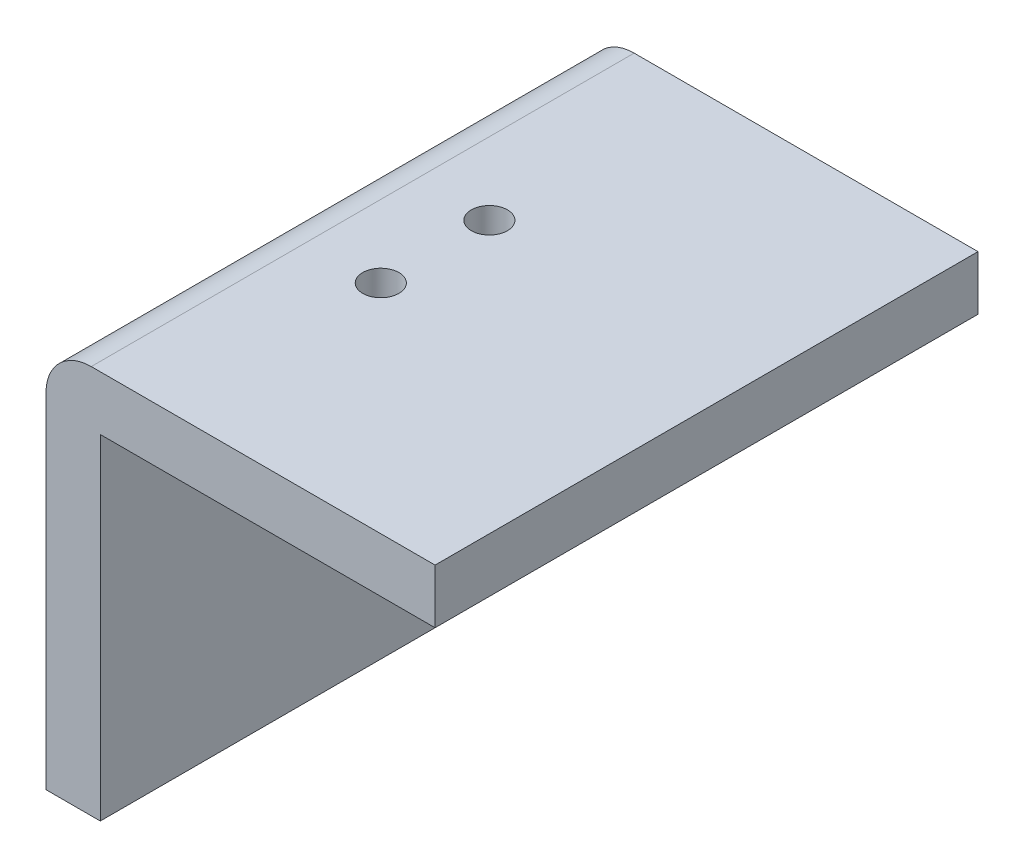
ISO-10303-21;
HEADER;
FILE_DESCRIPTION(('STEP AP214'),'2;1');
FILE_NAME('part.step','',(''),(''),'','','');
FILE_SCHEMA(('AUTOMOTIVE_DESIGN { 1 0 10303 214 1 1 1 1 }'));
ENDSEC;
DATA;
#1=APPLICATION_CONTEXT('core data for automotive mechanical design processes');
#2=APPLICATION_PROTOCOL_DEFINITION('international standard','automotive_design',2000,#1);
#3=PRODUCT_CONTEXT('',#1,'mechanical');
#4=PRODUCT('Part','Part','',(#3));
#5=PRODUCT_RELATED_PRODUCT_CATEGORY('part','',(#4));
#6=PRODUCT_DEFINITION_FORMATION('','',#4);
#7=PRODUCT_DEFINITION_CONTEXT('part definition',#1,'design');
#8=PRODUCT_DEFINITION('design','',#6,#7);
#9=PRODUCT_DEFINITION_SHAPE('','',#8);
#10=(LENGTH_UNIT() NAMED_UNIT(*) SI_UNIT(.MILLI.,.METRE.));
#11=(NAMED_UNIT(*) PLANE_ANGLE_UNIT() SI_UNIT($,.RADIAN.));
#12=(NAMED_UNIT(*) SI_UNIT($,.STERADIAN.) SOLID_ANGLE_UNIT());
#13=UNCERTAINTY_MEASURE_WITH_UNIT(LENGTH_MEASURE(1.E-05),#10,'distance_accuracy_value','');
#14=(GEOMETRIC_REPRESENTATION_CONTEXT(3) GLOBAL_UNCERTAINTY_ASSIGNED_CONTEXT((#13)) GLOBAL_UNIT_ASSIGNED_CONTEXT((#10,
#11,#12)) REPRESENTATION_CONTEXT('',''));
#15=CARTESIAN_POINT('',(0.,0.,0.));
#16=DIRECTION('',(0.,0.,1.));
#17=DIRECTION('',(1.,0.,0.));
#18=AXIS2_PLACEMENT_3D('',#15,#16,#17);
#19=CARTESIAN_POINT('',(-1.5,0.,30.));
#20=DIRECTION('',(-1.,0.,0.));
#21=DIRECTION('',(0.,0.,1.));
#22=AXIS2_PLACEMENT_3D('',#19,#20,#21);
#23=PLANE('',#22);
#24=DIRECTION('',(0.,1.,0.));
#25=VECTOR('',#24,1.);
#26=CARTESIAN_POINT('',(-1.5,0.,0.));
#27=LINE('',#26,#25);
#28=CARTESIAN_POINT('',(-1.5,0.,0.));
#29=VERTEX_POINT('',#28);
#30=CARTESIAN_POINT('',(-1.5,19.,0.));
#31=VERTEX_POINT('',#30);
#32=EDGE_CURVE('E126',#29,#31,#27,.T.);
#33=ORIENTED_EDGE('',*,*,#32,.F.);
#34=DIRECTION('',(0.,0.,-1.));
#35=VECTOR('',#34,1.);
#36=CARTESIAN_POINT('',(-1.5,0.,30.));
#37=LINE('',#36,#35);
#38=CARTESIAN_POINT('',(-1.5,0.,30.));
#39=VERTEX_POINT('',#38);
#40=EDGE_CURVE('E11',#39,#29,#37,.T.);
#41=ORIENTED_EDGE('',*,*,#40,.F.);
#42=DIRECTION('',(0.,1.,0.));
#43=VECTOR('',#42,1.);
#44=CARTESIAN_POINT('',(-1.5,0.,30.));
#45=LINE('',#44,#43);
#46=CARTESIAN_POINT('',(-1.5,19.,30.));
#47=VERTEX_POINT('',#46);
#48=EDGE_CURVE('E142',#39,#47,#45,.T.);
#49=ORIENTED_EDGE('',*,*,#48,.T.);
#50=DIRECTION('',(0.,0.,-1.));
#51=VECTOR('',#50,1.);
#52=CARTESIAN_POINT('',(-1.5,19.,30.));
#53=LINE('',#52,#51);
#54=EDGE_CURVE('E55',#47,#31,#53,.T.);
#55=ORIENTED_EDGE('',*,*,#54,.T.);
#56=EDGE_LOOP('',(#33,#41,#49,#55));
#57=FACE_BOUND('',#56,.T.);
#58=ADVANCED_FACE('F39',(#57),#23,.T.);
#59=CARTESIAN_POINT('',(0.,0.,30.));
#60=DIRECTION('',(0.,1.,0.));
#61=DIRECTION('',(0.,0.,1.));
#62=AXIS2_PLACEMENT_3D('',#59,#60,#61);
#63=PLANE('',#62);
#64=DIRECTION('',(1.,0.,0.));
#65=VECTOR('',#64,1.);
#66=CARTESIAN_POINT('',(0.,0.,0.));
#67=LINE('',#66,#65);
#68=CARTESIAN_POINT('',(1.5,0.,0.));
#69=VERTEX_POINT('',#68);
#70=EDGE_CURVE('E128',#29,#69,#67,.T.);
#71=ORIENTED_EDGE('',*,*,#70,.T.);
#72=DIRECTION('',(0.,0.,-1.));
#73=VECTOR('',#72,1.);
#74=CARTESIAN_POINT('',(1.5,0.,30.));
#75=LINE('',#74,#73);
#76=CARTESIAN_POINT('',(1.5,0.,30.));
#77=VERTEX_POINT('',#76);
#78=EDGE_CURVE('E47',#77,#69,#75,.T.);
#79=ORIENTED_EDGE('',*,*,#78,.F.);
#80=DIRECTION('',(1.,0.,0.));
#81=VECTOR('',#80,1.);
#82=CARTESIAN_POINT('',(0.,0.,30.));
#83=LINE('',#82,#81);
#84=EDGE_CURVE('E163',#39,#77,#83,.T.);
#85=ORIENTED_EDGE('',*,*,#84,.F.);
#86=ORIENTED_EDGE('',*,*,#40,.T.);
#87=EDGE_LOOP('',(#71,#79,#85,#86));
#88=FACE_BOUND('',#87,.T.);
#89=ADVANCED_FACE('F201',(#88),#63,.F.);
#90=CARTESIAN_POINT('',(1.5,0.,30.));
#91=DIRECTION('',(-1.,0.,0.));
#92=DIRECTION('',(0.,0.,1.));
#93=AXIS2_PLACEMENT_3D('',#90,#91,#92);
#94=PLANE('',#93);
#95=DIRECTION('',(0.,1.,0.));
#96=VECTOR('',#95,1.);
#97=CARTESIAN_POINT('',(1.5,0.,0.));
#98=LINE('',#97,#96);
#99=CARTESIAN_POINT('',(1.5,18.5,0.));
#100=VERTEX_POINT('',#99);
#101=EDGE_CURVE('E131',#69,#100,#98,.T.);
#102=ORIENTED_EDGE('',*,*,#101,.T.);
#103=DIRECTION('',(0.,0.,-1.));
#104=VECTOR('',#103,1.);
#105=CARTESIAN_POINT('',(1.5,18.5,30.));
#106=LINE('',#105,#104);
#107=CARTESIAN_POINT('',(1.5,18.5,30.));
#108=VERTEX_POINT('',#107);
#109=EDGE_CURVE('E146',#108,#100,#106,.T.);
#110=ORIENTED_EDGE('',*,*,#109,.F.);
#111=DIRECTION('',(0.,1.,0.));
#112=VECTOR('',#111,1.);
#113=CARTESIAN_POINT('',(1.5,0.,30.));
#114=LINE('',#113,#112);
#115=EDGE_CURVE('E155',#77,#108,#114,.T.);
#116=ORIENTED_EDGE('',*,*,#115,.F.);
#117=ORIENTED_EDGE('',*,*,#78,.T.);
#118=EDGE_LOOP('',(#102,#110,#116,#117));
#119=FACE_BOUND('',#118,.T.);
#120=ADVANCED_FACE('F153',(#119),#94,.F.);
#121=CARTESIAN_POINT('',(0.,18.5,30.));
#122=DIRECTION('',(0.,1.,0.));
#123=DIRECTION('',(0.,0.,1.));
#124=AXIS2_PLACEMENT_3D('',#121,#122,#123);
#125=PLANE('',#124);
#126=CARTESIAN_POINT('',(5.00000000000001,18.5,18.0000000000001));
#127=DIRECTION('',(0.,-1.,0.));
#128=DIRECTION('',(0.,0.,-1.));
#129=AXIS2_PLACEMENT_3D('',#126,#127,#128);
#130=CIRCLE('',#129,0.999999999999987);
#131=CARTESIAN_POINT('',(5.00000000000001,18.5,17.0000000000001));
#132=VERTEX_POINT('',#131);
#133=EDGE_CURVE('E176',#132,#132,#130,.T.);
#134=ORIENTED_EDGE('',*,*,#133,.F.);
#135=EDGE_LOOP('',(#134));
#136=FACE_BOUND('',#135,.T.);
#137=CARTESIAN_POINT('',(4.99999999999999,18.5,12.0000000000001));
#138=DIRECTION('',(0.,-1.,0.));
#139=DIRECTION('',(0.,0.,-1.));
#140=AXIS2_PLACEMENT_3D('',#137,#138,#139);
#141=CIRCLE('',#140,0.999999999999987);
#142=CARTESIAN_POINT('',(4.99999999999999,18.5,11.0000000000001));
#143=VERTEX_POINT('',#142);
#144=EDGE_CURVE('E170',#143,#143,#141,.T.);
#145=ORIENTED_EDGE('',*,*,#144,.F.);
#146=EDGE_LOOP('',(#145));
#147=FACE_BOUND('',#146,.T.);
#148=DIRECTION('',(1.,0.,0.));
#149=VECTOR('',#148,1.);
#150=CARTESIAN_POINT('',(0.,18.5,0.));
#151=LINE('',#150,#149);
#152=CARTESIAN_POINT('',(20.,18.5,0.));
#153=VERTEX_POINT('',#152);
#154=EDGE_CURVE('E133',#100,#153,#151,.T.);
#155=ORIENTED_EDGE('',*,*,#154,.T.);
#156=DIRECTION('',(0.,0.,-1.));
#157=VECTOR('',#156,1.);
#158=CARTESIAN_POINT('',(20.,18.5,30.));
#159=LINE('',#158,#157);
#160=CARTESIAN_POINT('',(20.,18.5,30.));
#161=VERTEX_POINT('',#160);
#162=EDGE_CURVE('E108',#161,#153,#159,.T.);
#163=ORIENTED_EDGE('',*,*,#162,.F.);
#164=DIRECTION('',(1.,0.,0.));
#165=VECTOR('',#164,1.);
#166=CARTESIAN_POINT('',(0.,18.5,30.));
#167=LINE('',#166,#165);
#168=EDGE_CURVE('E117',#108,#161,#167,.T.);
#169=ORIENTED_EDGE('',*,*,#168,.F.);
#170=ORIENTED_EDGE('',*,*,#109,.T.);
#171=EDGE_LOOP('',(#155,#163,#169,#170));
#172=FACE_BOUND('',#171,.T.);
#173=ADVANCED_FACE('F162',(#136,#147,#172),#125,.F.);
#174=CARTESIAN_POINT('',(20.,0.,30.));
#175=DIRECTION('',(1.,0.,0.));
#176=DIRECTION('',(0.,0.,-1.));
#177=AXIS2_PLACEMENT_3D('',#174,#175,#176);
#178=PLANE('',#177);
#179=DIRECTION('',(0.,-1.,0.));
#180=VECTOR('',#179,1.);
#181=CARTESIAN_POINT('',(20.,0.,0.));
#182=LINE('',#181,#180);
#183=CARTESIAN_POINT('',(20.,21.5,0.));
#184=VERTEX_POINT('',#183);
#185=EDGE_CURVE('E104',#184,#153,#182,.T.);
#186=ORIENTED_EDGE('',*,*,#185,.F.);
#187=DIRECTION('',(0.,0.,-1.));
#188=VECTOR('',#187,1.);
#189=CARTESIAN_POINT('',(20.,21.5,30.));
#190=LINE('',#189,#188);
#191=CARTESIAN_POINT('',(20.,21.5,30.));
#192=VERTEX_POINT('',#191);
#193=EDGE_CURVE('E99',#192,#184,#190,.T.);
#194=ORIENTED_EDGE('',*,*,#193,.F.);
#195=DIRECTION('',(0.,-1.,0.));
#196=VECTOR('',#195,1.);
#197=CARTESIAN_POINT('',(20.,0.,30.));
#198=LINE('',#197,#196);
#199=EDGE_CURVE('E102',#192,#161,#198,.T.);
#200=ORIENTED_EDGE('',*,*,#199,.T.);
#201=ORIENTED_EDGE('',*,*,#162,.T.);
#202=EDGE_LOOP('',(#186,#194,#200,#201));
#203=FACE_BOUND('',#202,.T.);
#204=ADVANCED_FACE('F101',(#203),#178,.T.);
#205=CARTESIAN_POINT('',(0.,21.5,30.));
#206=DIRECTION('',(0.,1.,0.));
#207=DIRECTION('',(-1.,0.,0.));
#208=AXIS2_PLACEMENT_3D('',#205,#206,#207);
#209=PLANE('',#208);
#210=CARTESIAN_POINT('',(5.00000000000001,21.5,18.0000000000001));
#211=DIRECTION('',(0.,-1.,0.));
#212=DIRECTION('',(0.,0.,-1.));
#213=AXIS2_PLACEMENT_3D('',#210,#211,#212);
#214=CIRCLE('',#213,0.999999999999987);
#215=CARTESIAN_POINT('',(5.00000000000001,21.5,17.0000000000001));
#216=VERTEX_POINT('',#215);
#217=EDGE_CURVE('E173',#216,#216,#214,.T.);
#218=ORIENTED_EDGE('',*,*,#217,.T.);
#219=EDGE_LOOP('',(#218));
#220=FACE_BOUND('',#219,.T.);
#221=CARTESIAN_POINT('',(4.99999999999999,21.5,12.0000000000001));
#222=DIRECTION('',(0.,-1.,0.));
#223=DIRECTION('',(0.,0.,-1.));
#224=AXIS2_PLACEMENT_3D('',#221,#222,#223);
#225=CIRCLE('',#224,0.999999999999987);
#226=CARTESIAN_POINT('',(4.99999999999999,21.5,11.0000000000001));
#227=VERTEX_POINT('',#226);
#228=EDGE_CURVE('E129',#227,#227,#225,.T.);
#229=ORIENTED_EDGE('',*,*,#228,.T.);
#230=EDGE_LOOP('',(#229));
#231=FACE_BOUND('',#230,.T.);
#232=DIRECTION('',(1.,0.,0.));
#233=VECTOR('',#232,1.);
#234=CARTESIAN_POINT('',(0.,21.5,0.));
#235=LINE('',#234,#233);
#236=CARTESIAN_POINT('',(1.,21.5,0.));
#237=VERTEX_POINT('',#236);
#238=EDGE_CURVE('E137',#237,#184,#235,.T.);
#239=ORIENTED_EDGE('',*,*,#238,.F.);
#240=DIRECTION('',(0.,0.,-1.));
#241=VECTOR('',#240,1.);
#242=CARTESIAN_POINT('',(1.,21.5,30.));
#243=LINE('',#242,#241);
#244=CARTESIAN_POINT('',(1.,21.5,30.));
#245=VERTEX_POINT('',#244);
#246=EDGE_CURVE('E77',#245,#237,#243,.T.);
#247=ORIENTED_EDGE('',*,*,#246,.F.);
#248=DIRECTION('',(1.,0.,0.));
#249=VECTOR('',#248,1.);
#250=CARTESIAN_POINT('',(0.,21.5,30.));
#251=LINE('',#250,#249);
#252=EDGE_CURVE('E115',#245,#192,#251,.T.);
#253=ORIENTED_EDGE('',*,*,#252,.T.);
#254=ORIENTED_EDGE('',*,*,#193,.T.);
#255=EDGE_LOOP('',(#239,#247,#253,#254));
#256=FACE_BOUND('',#255,.T.);
#257=ADVANCED_FACE('F120',(#220,#231,#256),#209,.T.);
#258=CARTESIAN_POINT('',(1.,19.,30.));
#259=DIRECTION('',(0.,0.,-1.));
#260=DIRECTION('',(-1.,0.,0.));
#261=AXIS2_PLACEMENT_3D('',#258,#259,#260);
#262=CYLINDRICAL_SURFACE('',#261,2.5);
#263=CARTESIAN_POINT('',(1.,19.,0.));
#264=DIRECTION('',(0.,0.,1.));
#265=DIRECTION('',(1.,0.,0.));
#266=AXIS2_PLACEMENT_3D('',#263,#264,#265);
#267=CIRCLE('',#266,2.5);
#268=EDGE_CURVE('E139',#31,#237,#267,.F.);
#269=ORIENTED_EDGE('',*,*,#268,.F.);
#270=ORIENTED_EDGE('',*,*,#54,.F.);
#271=CARTESIAN_POINT('',(1.,19.,30.));
#272=DIRECTION('',(0.,0.,1.));
#273=DIRECTION('',(1.,0.,0.));
#274=AXIS2_PLACEMENT_3D('',#271,#272,#273);
#275=CIRCLE('',#274,2.5);
#276=EDGE_CURVE('E121',#47,#245,#275,.F.);
#277=ORIENTED_EDGE('',*,*,#276,.T.);
#278=ORIENTED_EDGE('',*,*,#246,.T.);
#279=EDGE_LOOP('',(#269,#270,#277,#278));
#280=FACE_BOUND('',#279,.T.);
#281=ADVANCED_FACE('F205',(#280),#262,.T.);
#282=CARTESIAN_POINT('',(0.,0.,30.));
#283=DIRECTION('',(0.,0.,1.));
#284=DIRECTION('',(1.,0.,0.));
#285=AXIS2_PLACEMENT_3D('',#282,#283,#284);
#286=PLANE('',#285);
#287=ORIENTED_EDGE('',*,*,#48,.F.);
#288=ORIENTED_EDGE('',*,*,#84,.T.);
#289=ORIENTED_EDGE('',*,*,#115,.T.);
#290=ORIENTED_EDGE('',*,*,#168,.T.);
#291=ORIENTED_EDGE('',*,*,#199,.F.);
#292=ORIENTED_EDGE('',*,*,#252,.F.);
#293=ORIENTED_EDGE('',*,*,#276,.F.);
#294=EDGE_LOOP('',(#287,#288,#289,#290,#291,#292,#293));
#295=FACE_BOUND('',#294,.T.);
#296=ADVANCED_FACE('F113',(#295),#286,.T.);
#297=CARTESIAN_POINT('',(0.,0.,0.));
#298=DIRECTION('',(0.,0.,1.));
#299=DIRECTION('',(1.,0.,0.));
#300=AXIS2_PLACEMENT_3D('',#297,#298,#299);
#301=PLANE('',#300);
#302=ORIENTED_EDGE('',*,*,#32,.T.);
#303=ORIENTED_EDGE('',*,*,#268,.T.);
#304=ORIENTED_EDGE('',*,*,#238,.T.);
#305=ORIENTED_EDGE('',*,*,#185,.T.);
#306=ORIENTED_EDGE('',*,*,#154,.F.);
#307=ORIENTED_EDGE('',*,*,#101,.F.);
#308=ORIENTED_EDGE('',*,*,#70,.F.);
#309=EDGE_LOOP('',(#302,#303,#304,#305,#306,#307,#308));
#310=FACE_BOUND('',#309,.T.);
#311=ADVANCED_FACE('F160',(#310),#301,.F.);
#312=CARTESIAN_POINT('',(4.99999999999999,18.5,12.0000000000001));
#313=DIRECTION('',(0.,-1.,0.));
#314=DIRECTION('',(0.,0.,-1.));
#315=AXIS2_PLACEMENT_3D('',#312,#313,#314);
#316=CYLINDRICAL_SURFACE('',#315,0.999999999999987);
#317=ORIENTED_EDGE('',*,*,#228,.F.);
#318=EDGE_LOOP('',(#317));
#319=FACE_BOUND('',#318,.T.);
#320=ORIENTED_EDGE('',*,*,#144,.T.);
#321=EDGE_LOOP('',(#320));
#322=FACE_BOUND('',#321,.T.);
#323=ADVANCED_FACE('F187',(#319,#322),#316,.F.);
#324=CARTESIAN_POINT('',(5.00000000000001,18.5,18.0000000000001));
#325=DIRECTION('',(0.,-1.,0.));
#326=DIRECTION('',(0.,0.,-1.));
#327=AXIS2_PLACEMENT_3D('',#324,#325,#326);
#328=CYLINDRICAL_SURFACE('',#327,0.999999999999987);
#329=ORIENTED_EDGE('',*,*,#217,.F.);
#330=EDGE_LOOP('',(#329));
#331=FACE_BOUND('',#330,.T.);
#332=ORIENTED_EDGE('',*,*,#133,.T.);
#333=EDGE_LOOP('',(#332));
#334=FACE_BOUND('',#333,.T.);
#335=ADVANCED_FACE('F180',(#331,#334),#328,.F.);
#336=CLOSED_SHELL('',(#58,#89,#120,#173,#204,#257,#281,#296,#311,#323,#335));
#337=MANIFOLD_SOLID_BREP('B2',#336);
#338=ADVANCED_BREP_SHAPE_REPRESENTATION('',(#18,#337),#14);
#339=SHAPE_DEFINITION_REPRESENTATION(#9,#338);
ENDSEC;
END-ISO-10303-21;
